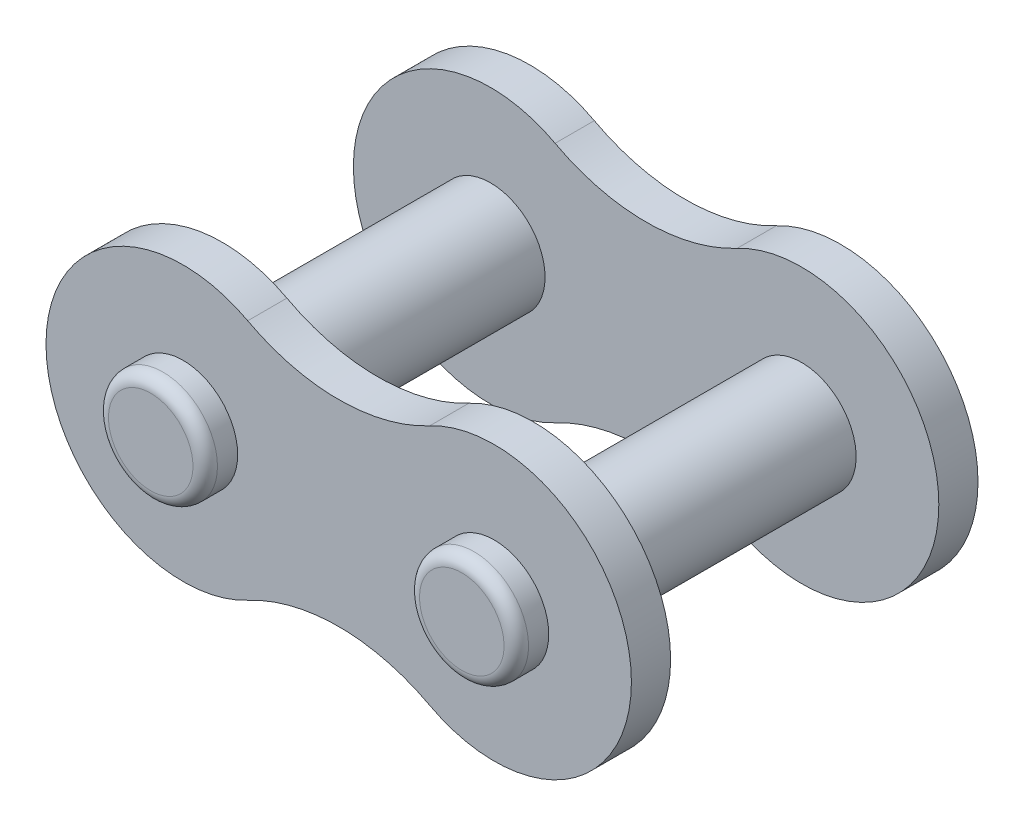
ISO-10303-21;
HEADER;
FILE_DESCRIPTION(('STEP AP214'),'2;1');
FILE_NAME('part.step','',(''),(''),'','','');
FILE_SCHEMA(('AUTOMOTIVE_DESIGN { 1 0 10303 214 1 1 1 1 }'));
ENDSEC;
DATA;
#1=APPLICATION_CONTEXT('core data for automotive mechanical design processes');
#2=APPLICATION_PROTOCOL_DEFINITION('international standard','automotive_design',2000,#1);
#3=PRODUCT_CONTEXT('',#1,'mechanical');
#4=PRODUCT('Part','Part','',(#3));
#5=PRODUCT_RELATED_PRODUCT_CATEGORY('part','',(#4));
#6=PRODUCT_DEFINITION_FORMATION('','',#4);
#7=PRODUCT_DEFINITION_CONTEXT('part definition',#1,'design');
#8=PRODUCT_DEFINITION('design','',#6,#7);
#9=PRODUCT_DEFINITION_SHAPE('','',#8);
#10=(LENGTH_UNIT() NAMED_UNIT(*) SI_UNIT(.MILLI.,.METRE.));
#11=(NAMED_UNIT(*) PLANE_ANGLE_UNIT() SI_UNIT($,.RADIAN.));
#12=(NAMED_UNIT(*) SI_UNIT($,.STERADIAN.) SOLID_ANGLE_UNIT());
#13=UNCERTAINTY_MEASURE_WITH_UNIT(LENGTH_MEASURE(1.E-05),#10,'distance_accuracy_value','');
#14=(GEOMETRIC_REPRESENTATION_CONTEXT(3) GLOBAL_UNCERTAINTY_ASSIGNED_CONTEXT((#13)) GLOBAL_UNIT_ASSIGNED_CONTEXT((#10,
#11,#12)) REPRESENTATION_CONTEXT('',''));
#15=CARTESIAN_POINT('',(0.,0.,0.));
#16=DIRECTION('',(0.,0.,1.));
#17=DIRECTION('',(1.,0.,0.));
#18=AXIS2_PLACEMENT_3D('',#15,#16,#17);
#19=CARTESIAN_POINT('',(0.,0.,-9.24000000000001));
#20=DIRECTION('',(0.,0.,-1.));
#21=DIRECTION('',(-1.,0.,0.));
#22=AXIS2_PLACEMENT_3D('',#19,#20,#21);
#23=CYLINDRICAL_SURFACE('',#22,2.225);
#24=CARTESIAN_POINT('',(0.,0.,-5.475));
#25=DIRECTION('',(0.,0.,-1.));
#26=DIRECTION('',(-1.,0.,0.));
#27=AXIS2_PLACEMENT_3D('',#24,#25,#26);
#28=CIRCLE('',#27,2.225);
#29=CARTESIAN_POINT('',(-2.225,0.,-5.475));
#30=VERTEX_POINT('',#29);
#31=EDGE_CURVE('E198',#30,#30,#28,.T.);
#32=ORIENTED_EDGE('',*,*,#31,.F.);
#33=EDGE_LOOP('',(#32));
#34=FACE_BOUND('',#33,.T.);
#35=CARTESIAN_POINT('',(0.,0.,5.475));
#36=DIRECTION('',(0.,0.,1.));
#37=DIRECTION('',(1.,0.,0.));
#38=AXIS2_PLACEMENT_3D('',#35,#36,#37);
#39=CIRCLE('',#38,2.225);
#40=CARTESIAN_POINT('',(2.225,0.,5.475));
#41=VERTEX_POINT('',#40);
#42=EDGE_CURVE('E11',#41,#41,#39,.T.);
#43=ORIENTED_EDGE('',*,*,#42,.F.);
#44=EDGE_LOOP('',(#43));
#45=FACE_BOUND('',#44,.T.);
#46=ADVANCED_FACE('F32',(#34,#45),#23,.T.);
#47=CARTESIAN_POINT('',(-12.7,0.,8.4));
#48=DIRECTION('',(0.,0.,1.));
#49=DIRECTION('',(1.,0.,0.));
#50=AXIS2_PLACEMENT_3D('',#47,#48,#49);
#51=CYLINDRICAL_SURFACE('',#50,2.225);
#52=CARTESIAN_POINT('',(-12.7,0.,-5.475));
#53=DIRECTION('',(0.,0.,-1.));
#54=DIRECTION('',(-1.,0.,0.));
#55=AXIS2_PLACEMENT_3D('',#52,#53,#54);
#56=CIRCLE('',#55,2.225);
#57=CARTESIAN_POINT('',(-14.925,0.,-5.475));
#58=VERTEX_POINT('',#57);
#59=EDGE_CURVE('E156',#58,#58,#56,.T.);
#60=ORIENTED_EDGE('',*,*,#59,.F.);
#61=EDGE_LOOP('',(#60));
#62=FACE_BOUND('',#61,.T.);
#63=CARTESIAN_POINT('',(-12.7,0.,5.475));
#64=DIRECTION('',(0.,0.,1.));
#65=DIRECTION('',(1.,0.,0.));
#66=AXIS2_PLACEMENT_3D('',#63,#64,#65);
#67=CIRCLE('',#66,2.225);
#68=CARTESIAN_POINT('',(-10.475,0.,5.475));
#69=VERTEX_POINT('',#68);
#70=EDGE_CURVE('E135',#69,#69,#67,.F.);
#71=ORIENTED_EDGE('',*,*,#70,.T.);
#72=EDGE_LOOP('',(#71));
#73=FACE_BOUND('',#72,.T.);
#74=ADVANCED_FACE('F203',(#62,#73),#51,.T.);
#75=CARTESIAN_POINT('',(0.,0.,-7.075));
#76=DIRECTION('',(0.,0.,-1.));
#77=DIRECTION('',(-1.,0.,0.));
#78=AXIS2_PLACEMENT_3D('',#75,#76,#77);
#79=CIRCLE('',#78,2.225);
#80=CARTESIAN_POINT('',(-2.225,0.,-7.075));
#81=VERTEX_POINT('',#80);
#82=EDGE_CURVE('E162',#81,#81,#79,.T.);
#83=ORIENTED_EDGE('',*,*,#82,.T.);
#84=EDGE_LOOP('',(#83));
#85=FACE_BOUND('',#84,.T.);
#86=CARTESIAN_POINT('',(0.,0.,-7.9));
#87=DIRECTION('',(0.,0.,-1.));
#88=DIRECTION('',(-1.,0.,0.));
#89=AXIS2_PLACEMENT_3D('',#86,#87,#88);
#90=CIRCLE('',#89,2.225);
#91=CARTESIAN_POINT('',(-2.225,0.,-7.9));
#92=VERTEX_POINT('',#91);
#93=EDGE_CURVE('E192',#92,#92,#90,.T.);
#94=ORIENTED_EDGE('',*,*,#93,.F.);
#95=EDGE_LOOP('',(#94));
#96=FACE_BOUND('',#95,.T.);
#97=ADVANCED_FACE('F213',(#85,#96),#23,.T.);
#98=CARTESIAN_POINT('',(0.,0.,-7.9));
#99=DIRECTION('',(0.,0.,-1.));
#100=DIRECTION('',(-1.,0.,0.));
#101=AXIS2_PLACEMENT_3D('',#98,#99,#100);
#102=TOROIDAL_SURFACE('',#101,1.725,0.5);
#103=CARTESIAN_POINT('',(0.,0.,-8.4));
#104=DIRECTION('',(0.,0.,-1.));
#105=DIRECTION('',(-1.,0.,0.));
#106=AXIS2_PLACEMENT_3D('',#103,#104,#105);
#107=CIRCLE('',#106,1.725);
#108=CARTESIAN_POINT('',(-1.725,0.,-8.4));
#109=VERTEX_POINT('',#108);
#110=EDGE_CURVE('E189',#109,#109,#107,.T.);
#111=ORIENTED_EDGE('',*,*,#110,.F.);
#112=EDGE_LOOP('',(#111));
#113=FACE_BOUND('',#112,.T.);
#114=ORIENTED_EDGE('',*,*,#93,.T.);
#115=EDGE_LOOP('',(#114));
#116=FACE_BOUND('',#115,.T.);
#117=ADVANCED_FACE('F226',(#113,#116),#102,.T.);
#118=CARTESIAN_POINT('',(0.,0.,-8.4));
#119=DIRECTION('',(0.,0.,1.));
#120=DIRECTION('',(1.,0.,0.));
#121=AXIS2_PLACEMENT_3D('',#118,#119,#120);
#122=PLANE('',#121);
#123=ORIENTED_EDGE('',*,*,#110,.T.);
#124=EDGE_LOOP('',(#123));
#125=FACE_BOUND('',#124,.T.);
#126=ADVANCED_FACE('F231',(#125),#122,.F.);
#127=CARTESIAN_POINT('',(-3.175,-5.95326666629339,-7.075));
#128=DIRECTION('',(0.,0.,-1.));
#129=DIRECTION('',(-1.,0.,0.));
#130=AXIS2_PLACEMENT_3D('',#127,#128,#129);
#131=PLANE('',#130);
#132=ORIENTED_EDGE('',*,*,#82,.F.);
#133=EDGE_LOOP('',(#132));
#134=FACE_BOUND('',#133,.T.);
#135=CARTESIAN_POINT('',(-6.35,-11.9065333325868,-7.075));
#136=DIRECTION('',(0.,0.,1.));
#137=DIRECTION('',(-1.,0.,0.));
#138=AXIS2_PLACEMENT_3D('',#135,#136,#137);
#139=CIRCLE('',#138,7.894);
#140=CARTESIAN_POINT('',(-2.63524529420483,-4.9412025094476,-7.075));
#141=VERTEX_POINT('',#140);
#142=CARTESIAN_POINT('',(-10.0647547057952,-4.9412025094476,-7.075));
#143=VERTEX_POINT('',#142);
#144=EDGE_CURVE('E166',#141,#143,#139,.T.);
#145=ORIENTED_EDGE('',*,*,#144,.T.);
#146=CARTESIAN_POINT('',(-12.7,0.,-7.075));
#147=DIRECTION('',(0.,0.,-1.));
#148=DIRECTION('',(-1.,0.,0.));
#149=AXIS2_PLACEMENT_3D('',#146,#147,#148);
#150=CIRCLE('',#149,5.6);
#151=CARTESIAN_POINT('',(-10.0647547057952,4.9412025094476,-7.075));
#152=VERTEX_POINT('',#151);
#153=EDGE_CURVE('E82',#143,#152,#150,.T.);
#154=ORIENTED_EDGE('',*,*,#153,.T.);
#155=CARTESIAN_POINT('',(-6.35,11.9065333325868,-7.075));
#156=DIRECTION('',(0.,0.,1.));
#157=DIRECTION('',(1.,0.,0.));
#158=AXIS2_PLACEMENT_3D('',#155,#156,#157);
#159=CIRCLE('',#158,7.894);
#160=CARTESIAN_POINT('',(-2.63524529420483,4.9412025094476,-7.075));
#161=VERTEX_POINT('',#160);
#162=EDGE_CURVE('E169',#152,#161,#159,.T.);
#163=ORIENTED_EDGE('',*,*,#162,.T.);
#164=CARTESIAN_POINT('',(0.,0.,-7.075));
#165=DIRECTION('',(0.,0.,-1.));
#166=DIRECTION('',(-1.,0.,0.));
#167=AXIS2_PLACEMENT_3D('',#164,#165,#166);
#168=CIRCLE('',#167,5.6);
#169=EDGE_CURVE('E50',#161,#141,#168,.T.);
#170=ORIENTED_EDGE('',*,*,#169,.T.);
#171=EDGE_LOOP('',(#145,#154,#163,#170));
#172=FACE_BOUND('',#171,.T.);
#173=CARTESIAN_POINT('',(-12.7,0.,-7.075));
#174=DIRECTION('',(0.,0.,-1.));
#175=DIRECTION('',(-1.,0.,0.));
#176=AXIS2_PLACEMENT_3D('',#173,#174,#175);
#177=CIRCLE('',#176,2.225);
#178=CARTESIAN_POINT('',(-14.925,0.,-7.075));
#179=VERTEX_POINT('',#178);
#180=EDGE_CURVE('E159',#179,#179,#177,.T.);
#181=ORIENTED_EDGE('',*,*,#180,.F.);
#182=EDGE_LOOP('',(#181));
#183=FACE_BOUND('',#182,.T.);
#184=ADVANCED_FACE('F238',(#134,#172,#183),#131,.T.);
#185=CARTESIAN_POINT('',(-3.175,-5.95326666629339,-5.475));
#186=DIRECTION('',(0.,0.,-1.));
#187=DIRECTION('',(-1.,0.,0.));
#188=AXIS2_PLACEMENT_3D('',#185,#186,#187);
#189=PLANE('',#188);
#190=CARTESIAN_POINT('',(-6.35,-11.9065333325868,-5.475));
#191=DIRECTION('',(0.,0.,1.));
#192=DIRECTION('',(-1.,0.,0.));
#193=AXIS2_PLACEMENT_3D('',#190,#191,#192);
#194=CIRCLE('',#193,7.894);
#195=CARTESIAN_POINT('',(-2.63524529420483,-4.9412025094476,-5.475));
#196=VERTEX_POINT('',#195);
#197=CARTESIAN_POINT('',(-10.0647547057952,-4.9412025094476,-5.475));
#198=VERTEX_POINT('',#197);
#199=EDGE_CURVE('E165',#196,#198,#194,.T.);
#200=ORIENTED_EDGE('',*,*,#199,.F.);
#201=CARTESIAN_POINT('',(0.,0.,-5.475));
#202=DIRECTION('',(0.,0.,-1.));
#203=DIRECTION('',(-1.,0.,0.));
#204=AXIS2_PLACEMENT_3D('',#201,#202,#203);
#205=CIRCLE('',#204,5.6);
#206=CARTESIAN_POINT('',(-2.63524529420483,4.9412025094476,-5.475));
#207=VERTEX_POINT('',#206);
#208=EDGE_CURVE('E74',#207,#196,#205,.T.);
#209=ORIENTED_EDGE('',*,*,#208,.F.);
#210=CARTESIAN_POINT('',(-6.35,11.9065333325868,-5.475));
#211=DIRECTION('',(0.,0.,1.));
#212=DIRECTION('',(1.,0.,0.));
#213=AXIS2_PLACEMENT_3D('',#210,#211,#212);
#214=CIRCLE('',#213,7.894);
#215=CARTESIAN_POINT('',(-10.0647547057952,4.9412025094476,-5.475));
#216=VERTEX_POINT('',#215);
#217=EDGE_CURVE('E68',#216,#207,#214,.T.);
#218=ORIENTED_EDGE('',*,*,#217,.F.);
#219=CARTESIAN_POINT('',(-12.7,0.,-5.475));
#220=DIRECTION('',(0.,0.,-1.));
#221=DIRECTION('',(-1.,0.,0.));
#222=AXIS2_PLACEMENT_3D('',#219,#220,#221);
#223=CIRCLE('',#222,5.6);
#224=EDGE_CURVE('E175',#198,#216,#223,.T.);
#225=ORIENTED_EDGE('',*,*,#224,.F.);
#226=EDGE_LOOP('',(#200,#209,#218,#225));
#227=FACE_BOUND('',#226,.T.);
#228=ORIENTED_EDGE('',*,*,#31,.T.);
#229=EDGE_LOOP('',(#228));
#230=FACE_BOUND('',#229,.T.);
#231=ORIENTED_EDGE('',*,*,#59,.T.);
#232=EDGE_LOOP('',(#231));
#233=FACE_BOUND('',#232,.T.);
#234=ADVANCED_FACE('F240',(#227,#230,#233),#189,.F.);
#235=CARTESIAN_POINT('',(-6.35,-11.9065333325868,-7.075));
#236=DIRECTION('',(0.,0.,1.));
#237=DIRECTION('',(1.,0.,0.));
#238=AXIS2_PLACEMENT_3D('',#235,#236,#237);
#239=CYLINDRICAL_SURFACE('',#238,7.894);
#240=ORIENTED_EDGE('',*,*,#199,.T.);
#241=DIRECTION('',(0.,0.,1.));
#242=VECTOR('',#241,1.);
#243=CARTESIAN_POINT('',(-10.0647547057952,-4.9412025094476,-7.075));
#244=LINE('',#243,#242);
#245=EDGE_CURVE('E184',#143,#198,#244,.T.);
#246=ORIENTED_EDGE('',*,*,#245,.F.);
#247=ORIENTED_EDGE('',*,*,#144,.F.);
#248=DIRECTION('',(0.,0.,1.));
#249=VECTOR('',#248,1.);
#250=CARTESIAN_POINT('',(-2.63524529420483,-4.9412025094476,-7.075));
#251=LINE('',#250,#249);
#252=EDGE_CURVE('E172',#141,#196,#251,.T.);
#253=ORIENTED_EDGE('',*,*,#252,.T.);
#254=EDGE_LOOP('',(#240,#246,#247,#253));
#255=FACE_BOUND('',#254,.T.);
#256=ADVANCED_FACE('F274',(#255),#239,.F.);
#257=CARTESIAN_POINT('',(-12.7,0.,-7.075));
#258=DIRECTION('',(0.,0.,1.));
#259=DIRECTION('',(1.,0.,0.));
#260=AXIS2_PLACEMENT_3D('',#257,#258,#259);
#261=CYLINDRICAL_SURFACE('',#260,5.6);
#262=ORIENTED_EDGE('',*,*,#224,.T.);
#263=DIRECTION('',(0.,0.,1.));
#264=VECTOR('',#263,1.);
#265=CARTESIAN_POINT('',(-10.0647547057952,4.9412025094476,-7.075));
#266=LINE('',#265,#264);
#267=EDGE_CURVE('E182',#152,#216,#266,.T.);
#268=ORIENTED_EDGE('',*,*,#267,.F.);
#269=ORIENTED_EDGE('',*,*,#153,.F.);
#270=ORIENTED_EDGE('',*,*,#245,.T.);
#271=EDGE_LOOP('',(#262,#268,#269,#270));
#272=FACE_BOUND('',#271,.T.);
#273=ADVANCED_FACE('F281',(#272),#261,.T.);
#274=CARTESIAN_POINT('',(-6.35,11.9065333325868,-7.075));
#275=DIRECTION('',(0.,0.,1.));
#276=DIRECTION('',(1.,0.,0.));
#277=AXIS2_PLACEMENT_3D('',#274,#275,#276);
#278=CYLINDRICAL_SURFACE('',#277,7.894);
#279=ORIENTED_EDGE('',*,*,#217,.T.);
#280=DIRECTION('',(0.,0.,1.));
#281=VECTOR('',#280,1.);
#282=CARTESIAN_POINT('',(-2.63524529420483,4.9412025094476,-7.075));
#283=LINE('',#282,#281);
#284=EDGE_CURVE('E180',#161,#207,#283,.T.);
#285=ORIENTED_EDGE('',*,*,#284,.F.);
#286=ORIENTED_EDGE('',*,*,#162,.F.);
#287=ORIENTED_EDGE('',*,*,#267,.T.);
#288=EDGE_LOOP('',(#279,#285,#286,#287));
#289=FACE_BOUND('',#288,.T.);
#290=ADVANCED_FACE('F278',(#289),#278,.F.);
#291=CARTESIAN_POINT('',(0.,0.,-7.075));
#292=DIRECTION('',(0.,0.,1.));
#293=DIRECTION('',(1.,0.,0.));
#294=AXIS2_PLACEMENT_3D('',#291,#292,#293);
#295=CYLINDRICAL_SURFACE('',#294,5.6);
#296=ORIENTED_EDGE('',*,*,#208,.T.);
#297=ORIENTED_EDGE('',*,*,#252,.F.);
#298=ORIENTED_EDGE('',*,*,#169,.F.);
#299=ORIENTED_EDGE('',*,*,#284,.T.);
#300=EDGE_LOOP('',(#296,#297,#298,#299));
#301=FACE_BOUND('',#300,.T.);
#302=ADVANCED_FACE('F259',(#301),#295,.T.);
#303=CARTESIAN_POINT('',(-14.425,0.,-8.4));
#304=DIRECTION('',(0.,0.,-1.));
#305=DIRECTION('',(-1.,0.,0.));
#306=AXIS2_PLACEMENT_3D('',#303,#304,#305);
#307=PLANE('',#306);
#308=CARTESIAN_POINT('',(-12.7,0.,-8.4));
#309=DIRECTION('',(0.,0.,1.));
#310=DIRECTION('',(1.,0.,0.));
#311=AXIS2_PLACEMENT_3D('',#308,#309,#310);
#312=CIRCLE('',#311,1.725);
#313=CARTESIAN_POINT('',(-10.975,0.,-8.4));
#314=VERTEX_POINT('',#313);
#315=EDGE_CURVE('E150',#314,#314,#312,.T.);
#316=ORIENTED_EDGE('',*,*,#315,.F.);
#317=EDGE_LOOP('',(#316));
#318=FACE_BOUND('',#317,.T.);
#319=ADVANCED_FACE('F253',(#318),#307,.T.);
#320=CARTESIAN_POINT('',(-12.7,0.,-7.9));
#321=DIRECTION('',(0.,0.,1.));
#322=DIRECTION('',(1.,0.,0.));
#323=AXIS2_PLACEMENT_3D('',#320,#321,#322);
#324=TOROIDAL_SURFACE('',#323,1.725,0.5);
#325=ORIENTED_EDGE('',*,*,#315,.T.);
#326=EDGE_LOOP('',(#325));
#327=FACE_BOUND('',#326,.T.);
#328=CARTESIAN_POINT('',(-12.7,0.,-7.9));
#329=DIRECTION('',(0.,0.,1.));
#330=DIRECTION('',(1.,0.,0.));
#331=AXIS2_PLACEMENT_3D('',#328,#329,#330);
#332=CIRCLE('',#331,2.225);
#333=CARTESIAN_POINT('',(-10.475,0.,-7.9));
#334=VERTEX_POINT('',#333);
#335=EDGE_CURVE('E147',#334,#334,#332,.T.);
#336=ORIENTED_EDGE('',*,*,#335,.F.);
#337=EDGE_LOOP('',(#336));
#338=FACE_BOUND('',#337,.T.);
#339=ADVANCED_FACE('F249',(#327,#338),#324,.T.);
#340=ORIENTED_EDGE('',*,*,#180,.T.);
#341=EDGE_LOOP('',(#340));
#342=FACE_BOUND('',#341,.T.);
#343=ORIENTED_EDGE('',*,*,#335,.T.);
#344=EDGE_LOOP('',(#343));
#345=FACE_BOUND('',#344,.T.);
#346=ADVANCED_FACE('F220',(#342,#345),#51,.T.);
#347=CARTESIAN_POINT('',(-3.175,-5.95326666629339,7.075));
#348=DIRECTION('',(0.,0.,1.));
#349=DIRECTION('',(-1.,0.,0.));
#350=AXIS2_PLACEMENT_3D('',#347,#348,#349);
#351=PLANE('',#350);
#352=CARTESIAN_POINT('',(-12.7,0.,7.075));
#353=DIRECTION('',(0.,0.,1.));
#354=DIRECTION('',(1.,0.,0.));
#355=AXIS2_PLACEMENT_3D('',#352,#353,#354);
#356=CIRCLE('',#355,2.225);
#357=CARTESIAN_POINT('',(-10.475,0.,7.075));
#358=VERTEX_POINT('',#357);
#359=EDGE_CURVE('E36',#358,#358,#356,.F.);
#360=ORIENTED_EDGE('',*,*,#359,.T.);
#361=EDGE_LOOP('',(#360));
#362=FACE_BOUND('',#361,.T.);
#363=CARTESIAN_POINT('',(-6.35,-11.9065333325868,7.075));
#364=DIRECTION('',(0.,0.,1.));
#365=DIRECTION('',(-1.,0.,0.));
#366=AXIS2_PLACEMENT_3D('',#363,#364,#365);
#367=CIRCLE('',#366,7.894);
#368=CARTESIAN_POINT('',(-2.63524529420483,-4.9412025094476,7.075));
#369=VERTEX_POINT('',#368);
#370=CARTESIAN_POINT('',(-10.0647547057952,-4.9412025094476,7.075));
#371=VERTEX_POINT('',#370);
#372=EDGE_CURVE('E133',#369,#371,#367,.T.);
#373=ORIENTED_EDGE('',*,*,#372,.F.);
#374=CARTESIAN_POINT('',(0.,0.,7.075));
#375=DIRECTION('',(0.,0.,-1.));
#376=DIRECTION('',(-1.,0.,0.));
#377=AXIS2_PLACEMENT_3D('',#374,#375,#376);
#378=CIRCLE('',#377,5.6);
#379=CARTESIAN_POINT('',(-2.63524529420483,4.9412025094476,7.075));
#380=VERTEX_POINT('',#379);
#381=EDGE_CURVE('E115',#380,#369,#378,.T.);
#382=ORIENTED_EDGE('',*,*,#381,.F.);
#383=CARTESIAN_POINT('',(-6.35,11.9065333325868,7.075));
#384=DIRECTION('',(0.,0.,1.));
#385=DIRECTION('',(1.,0.,0.));
#386=AXIS2_PLACEMENT_3D('',#383,#384,#385);
#387=CIRCLE('',#386,7.894);
#388=CARTESIAN_POINT('',(-10.0647547057952,4.9412025094476,7.075));
#389=VERTEX_POINT('',#388);
#390=EDGE_CURVE('E467',#389,#380,#387,.T.);
#391=ORIENTED_EDGE('',*,*,#390,.F.);
#392=CARTESIAN_POINT('',(-12.7,0.,7.075));
#393=DIRECTION('',(0.,0.,-1.));
#394=DIRECTION('',(-1.,0.,0.));
#395=AXIS2_PLACEMENT_3D('',#392,#393,#394);
#396=CIRCLE('',#395,5.6);
#397=EDGE_CURVE('E137',#371,#389,#396,.T.);
#398=ORIENTED_EDGE('',*,*,#397,.F.);
#399=EDGE_LOOP('',(#373,#382,#391,#398));
#400=FACE_BOUND('',#399,.T.);
#401=CARTESIAN_POINT('',(0.,0.,7.075));
#402=DIRECTION('',(0.,0.,1.));
#403=DIRECTION('',(1.,0.,0.));
#404=AXIS2_PLACEMENT_3D('',#401,#402,#403);
#405=CIRCLE('',#404,2.225);
#406=CARTESIAN_POINT('',(2.225,0.,7.075));
#407=VERTEX_POINT('',#406);
#408=EDGE_CURVE('E141',#407,#407,#405,.T.);
#409=ORIENTED_EDGE('',*,*,#408,.F.);
#410=EDGE_LOOP('',(#409));
#411=FACE_BOUND('',#410,.T.);
#412=ADVANCED_FACE('F206',(#362,#400,#411),#351,.T.);
#413=CARTESIAN_POINT('',(-3.175,-5.95326666629339,5.475));
#414=DIRECTION('',(0.,0.,1.));
#415=DIRECTION('',(-1.,0.,0.));
#416=AXIS2_PLACEMENT_3D('',#413,#414,#415);
#417=PLANE('',#416);
#418=CARTESIAN_POINT('',(-6.35,-11.9065333325868,5.475));
#419=DIRECTION('',(0.,0.,1.));
#420=DIRECTION('',(-1.,0.,0.));
#421=AXIS2_PLACEMENT_3D('',#418,#419,#420);
#422=CIRCLE('',#421,7.894);
#423=CARTESIAN_POINT('',(-2.63524529420483,-4.9412025094476,5.475));
#424=VERTEX_POINT('',#423);
#425=CARTESIAN_POINT('',(-10.0647547057952,-4.9412025094476,5.475));
#426=VERTEX_POINT('',#425);
#427=EDGE_CURVE('E126',#424,#426,#422,.T.);
#428=ORIENTED_EDGE('',*,*,#427,.T.);
#429=CARTESIAN_POINT('',(-12.7,0.,5.475));
#430=DIRECTION('',(0.,0.,-1.));
#431=DIRECTION('',(-1.,0.,0.));
#432=AXIS2_PLACEMENT_3D('',#429,#430,#431);
#433=CIRCLE('',#432,5.6);
#434=CARTESIAN_POINT('',(-10.0647547057952,4.9412025094476,5.475));
#435=VERTEX_POINT('',#434);
#436=EDGE_CURVE('E468',#426,#435,#433,.T.);
#437=ORIENTED_EDGE('',*,*,#436,.T.);
#438=CARTESIAN_POINT('',(-6.35,11.9065333325868,5.475));
#439=DIRECTION('',(0.,0.,1.));
#440=DIRECTION('',(1.,0.,0.));
#441=AXIS2_PLACEMENT_3D('',#438,#439,#440);
#442=CIRCLE('',#441,7.894);
#443=CARTESIAN_POINT('',(-2.63524529420483,4.9412025094476,5.475));
#444=VERTEX_POINT('',#443);
#445=EDGE_CURVE('E128',#435,#444,#442,.T.);
#446=ORIENTED_EDGE('',*,*,#445,.T.);
#447=CARTESIAN_POINT('',(0.,0.,5.475));
#448=DIRECTION('',(0.,0.,-1.));
#449=DIRECTION('',(-1.,0.,0.));
#450=AXIS2_PLACEMENT_3D('',#447,#448,#449);
#451=CIRCLE('',#450,5.6);
#452=EDGE_CURVE('E112',#444,#424,#451,.T.);
#453=ORIENTED_EDGE('',*,*,#452,.T.);
#454=EDGE_LOOP('',(#428,#437,#446,#453));
#455=FACE_BOUND('',#454,.T.);
#456=ORIENTED_EDGE('',*,*,#70,.F.);
#457=EDGE_LOOP('',(#456));
#458=FACE_BOUND('',#457,.T.);
#459=ORIENTED_EDGE('',*,*,#42,.T.);
#460=EDGE_LOOP('',(#459));
#461=FACE_BOUND('',#460,.T.);
#462=ADVANCED_FACE('F123',(#455,#458,#461),#417,.F.);
#463=CARTESIAN_POINT('',(-6.35,-11.9065333325868,7.075));
#464=DIRECTION('',(0.,0.,-1.));
#465=DIRECTION('',(1.,0.,0.));
#466=AXIS2_PLACEMENT_3D('',#463,#464,#465);
#467=CYLINDRICAL_SURFACE('',#466,7.894);
#468=ORIENTED_EDGE('',*,*,#427,.F.);
#469=DIRECTION('',(0.,0.,-1.));
#470=VECTOR('',#469,1.);
#471=CARTESIAN_POINT('',(-2.63524529420483,-4.9412025094476,7.075));
#472=LINE('',#471,#470);
#473=EDGE_CURVE('E109',#369,#424,#472,.T.);
#474=ORIENTED_EDGE('',*,*,#473,.F.);
#475=ORIENTED_EDGE('',*,*,#372,.T.);
#476=DIRECTION('',(0.,0.,-1.));
#477=VECTOR('',#476,1.);
#478=CARTESIAN_POINT('',(-10.0647547057952,-4.9412025094476,7.075));
#479=LINE('',#478,#477);
#480=EDGE_CURVE('E131',#371,#426,#479,.T.);
#481=ORIENTED_EDGE('',*,*,#480,.T.);
#482=EDGE_LOOP('',(#468,#474,#475,#481));
#483=FACE_BOUND('',#482,.T.);
#484=ADVANCED_FACE('F130',(#483),#467,.F.);
#485=CARTESIAN_POINT('',(-12.7,0.,7.075));
#486=DIRECTION('',(0.,0.,-1.));
#487=DIRECTION('',(1.,0.,0.));
#488=AXIS2_PLACEMENT_3D('',#485,#486,#487);
#489=CYLINDRICAL_SURFACE('',#488,5.6);
#490=ORIENTED_EDGE('',*,*,#436,.F.);
#491=ORIENTED_EDGE('',*,*,#480,.F.);
#492=ORIENTED_EDGE('',*,*,#397,.T.);
#493=DIRECTION('',(0.,0.,-1.));
#494=VECTOR('',#493,1.);
#495=CARTESIAN_POINT('',(-10.0647547057952,4.9412025094476,7.075));
#496=LINE('',#495,#494);
#497=EDGE_CURVE('E469',#389,#435,#496,.T.);
#498=ORIENTED_EDGE('',*,*,#497,.T.);
#499=EDGE_LOOP('',(#490,#491,#492,#498));
#500=FACE_BOUND('',#499,.T.);
#501=ADVANCED_FACE('F375',(#500),#489,.T.);
#502=CARTESIAN_POINT('',(-6.35,11.9065333325868,7.075));
#503=DIRECTION('',(0.,0.,-1.));
#504=DIRECTION('',(1.,0.,0.));
#505=AXIS2_PLACEMENT_3D('',#502,#503,#504);
#506=CYLINDRICAL_SURFACE('',#505,7.894);
#507=ORIENTED_EDGE('',*,*,#445,.F.);
#508=ORIENTED_EDGE('',*,*,#497,.F.);
#509=ORIENTED_EDGE('',*,*,#390,.T.);
#510=DIRECTION('',(0.,0.,-1.));
#511=VECTOR('',#510,1.);
#512=CARTESIAN_POINT('',(-2.63524529420483,4.9412025094476,7.075));
#513=LINE('',#512,#511);
#514=EDGE_CURVE('E475',#380,#444,#513,.T.);
#515=ORIENTED_EDGE('',*,*,#514,.T.);
#516=EDGE_LOOP('',(#507,#508,#509,#515));
#517=FACE_BOUND('',#516,.T.);
#518=ADVANCED_FACE('F384',(#517),#506,.F.);
#519=CARTESIAN_POINT('',(0.,0.,7.075));
#520=DIRECTION('',(0.,0.,-1.));
#521=DIRECTION('',(1.,0.,0.));
#522=AXIS2_PLACEMENT_3D('',#519,#520,#521);
#523=CYLINDRICAL_SURFACE('',#522,5.6);
#524=ORIENTED_EDGE('',*,*,#452,.F.);
#525=ORIENTED_EDGE('',*,*,#514,.F.);
#526=ORIENTED_EDGE('',*,*,#381,.T.);
#527=ORIENTED_EDGE('',*,*,#473,.T.);
#528=EDGE_LOOP('',(#524,#525,#526,#527));
#529=FACE_BOUND('',#528,.T.);
#530=ADVANCED_FACE('F111',(#529),#523,.T.);
#531=CARTESIAN_POINT('',(-12.7,0.,8.4));
#532=DIRECTION('',(0.,0.,1.));
#533=DIRECTION('',(1.,0.,0.));
#534=AXIS2_PLACEMENT_3D('',#531,#532,#533);
#535=PLANE('',#534);
#536=CARTESIAN_POINT('',(-12.7,0.,8.4));
#537=DIRECTION('',(0.,0.,1.));
#538=DIRECTION('',(1.,0.,0.));
#539=AXIS2_PLACEMENT_3D('',#536,#537,#538);
#540=CIRCLE('',#539,1.725);
#541=CARTESIAN_POINT('',(-10.975,0.,8.4));
#542=VERTEX_POINT('',#541);
#543=EDGE_CURVE('E153',#542,#542,#540,.T.);
#544=ORIENTED_EDGE('',*,*,#543,.T.);
#545=EDGE_LOOP('',(#544));
#546=FACE_BOUND('',#545,.T.);
#547=ADVANCED_FACE('F264',(#546),#535,.T.);
#548=CARTESIAN_POINT('',(-12.7,0.,7.9));
#549=DIRECTION('',(0.,0.,1.));
#550=DIRECTION('',(1.,0.,0.));
#551=AXIS2_PLACEMENT_3D('',#548,#549,#550);
#552=TOROIDAL_SURFACE('',#551,1.725,0.5);
#553=CARTESIAN_POINT('',(-12.7,0.,7.9));
#554=DIRECTION('',(0.,0.,1.));
#555=DIRECTION('',(1.,0.,0.));
#556=AXIS2_PLACEMENT_3D('',#553,#554,#555);
#557=CIRCLE('',#556,2.225);
#558=CARTESIAN_POINT('',(-10.475,0.,7.9));
#559=VERTEX_POINT('',#558);
#560=EDGE_CURVE('E144',#559,#559,#557,.T.);
#561=ORIENTED_EDGE('',*,*,#560,.T.);
#562=EDGE_LOOP('',(#561));
#563=FACE_BOUND('',#562,.T.);
#564=ORIENTED_EDGE('',*,*,#543,.F.);
#565=EDGE_LOOP('',(#564));
#566=FACE_BOUND('',#565,.T.);
#567=ADVANCED_FACE('F267',(#563,#566),#552,.T.);
#568=ORIENTED_EDGE('',*,*,#359,.F.);
#569=EDGE_LOOP('',(#568));
#570=FACE_BOUND('',#569,.T.);
#571=ORIENTED_EDGE('',*,*,#560,.F.);
#572=EDGE_LOOP('',(#571));
#573=FACE_BOUND('',#572,.T.);
#574=ADVANCED_FACE('F219',(#570,#573),#51,.T.);
#575=CARTESIAN_POINT('',(1.725,0.,8.4));
#576=DIRECTION('',(0.,0.,-1.));
#577=DIRECTION('',(-1.,0.,0.));
#578=AXIS2_PLACEMENT_3D('',#575,#576,#577);
#579=PLANE('',#578);
#580=CARTESIAN_POINT('',(0.,0.,8.4));
#581=DIRECTION('',(0.,0.,-1.));
#582=DIRECTION('',(-1.,0.,0.));
#583=AXIS2_PLACEMENT_3D('',#580,#581,#582);
#584=CIRCLE('',#583,1.725);
#585=CARTESIAN_POINT('',(-1.725,0.,8.4));
#586=VERTEX_POINT('',#585);
#587=EDGE_CURVE('E186',#586,#586,#584,.T.);
#588=ORIENTED_EDGE('',*,*,#587,.F.);
#589=EDGE_LOOP('',(#588));
#590=FACE_BOUND('',#589,.T.);
#591=ADVANCED_FACE('F287',(#590),#579,.F.);
#592=CARTESIAN_POINT('',(0.,0.,7.9));
#593=DIRECTION('',(0.,0.,-1.));
#594=DIRECTION('',(-1.,0.,0.));
#595=AXIS2_PLACEMENT_3D('',#592,#593,#594);
#596=TOROIDAL_SURFACE('',#595,1.725,0.5);
#597=CARTESIAN_POINT('',(0.,0.,7.9));
#598=DIRECTION('',(0.,0.,-1.));
#599=DIRECTION('',(-1.,0.,0.));
#600=AXIS2_PLACEMENT_3D('',#597,#598,#599);
#601=CIRCLE('',#600,2.225);
#602=CARTESIAN_POINT('',(-2.225,0.,7.9));
#603=VERTEX_POINT('',#602);
#604=EDGE_CURVE('E195',#603,#603,#601,.T.);
#605=ORIENTED_EDGE('',*,*,#604,.F.);
#606=EDGE_LOOP('',(#605));
#607=FACE_BOUND('',#606,.T.);
#608=ORIENTED_EDGE('',*,*,#587,.T.);
#609=EDGE_LOOP('',(#608));
#610=FACE_BOUND('',#609,.T.);
#611=ADVANCED_FACE('F34',(#607,#610),#596,.T.);
#612=ORIENTED_EDGE('',*,*,#408,.T.);
#613=EDGE_LOOP('',(#612));
#614=FACE_BOUND('',#613,.T.);
#615=ORIENTED_EDGE('',*,*,#604,.T.);
#616=EDGE_LOOP('',(#615));
#617=FACE_BOUND('',#616,.T.);
#618=ADVANCED_FACE('F212',(#614,#617),#23,.T.);
#619=CLOSED_SHELL('',(#46,#74,#97,#117,#126,#184,#234,#256,#273,#290,#302,#319,#339,#346,#412,
#462,#484,#501,#518,#530,#547,#567,#574,#591,#611,#618));
#620=MANIFOLD_SOLID_BREP('B2',#619);
#621=ADVANCED_BREP_SHAPE_REPRESENTATION('',(#18,#620),#14);
#622=SHAPE_DEFINITION_REPRESENTATION(#9,#621);
ENDSEC;
END-ISO-10303-21;
